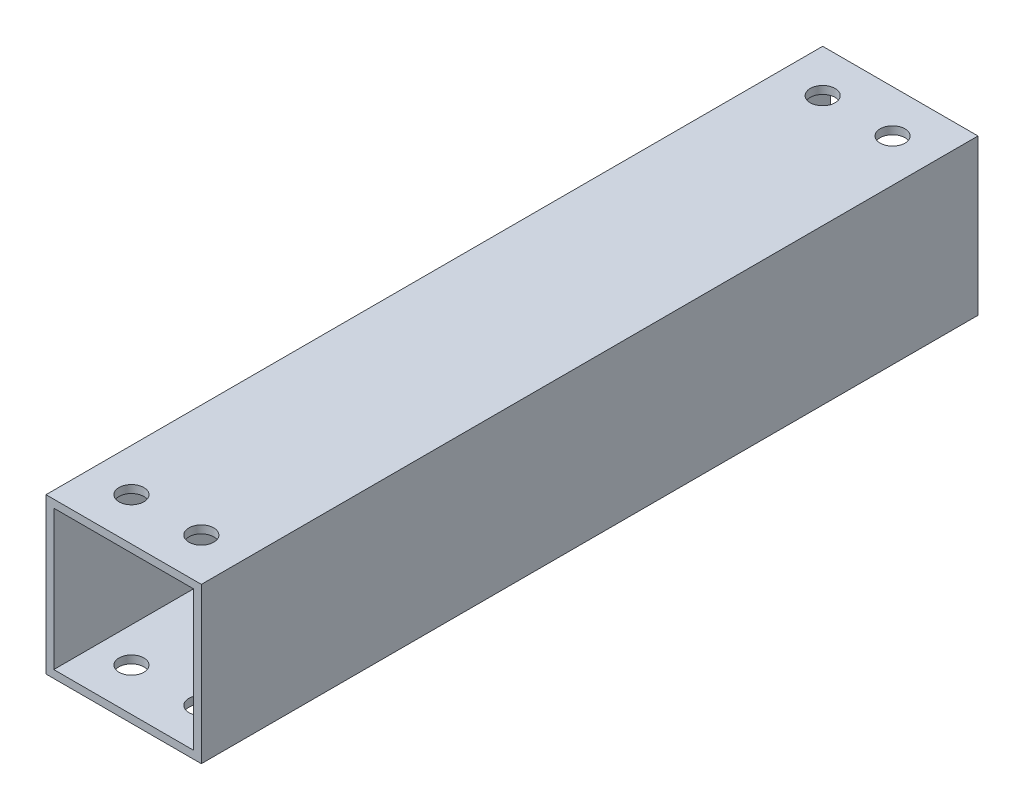
ISO-10303-21;
HEADER;
FILE_DESCRIPTION(('STEP AP214'),'2;1');
FILE_NAME('part.step','',(''),(''),'','','');
FILE_SCHEMA(('AUTOMOTIVE_DESIGN { 1 0 10303 214 1 1 1 1 }'));
ENDSEC;
DATA;
#1=APPLICATION_CONTEXT('core data for automotive mechanical design processes');
#2=APPLICATION_PROTOCOL_DEFINITION('international standard','automotive_design',2000,#1);
#3=PRODUCT_CONTEXT('',#1,'mechanical');
#4=PRODUCT('Part','Part','',(#3));
#5=PRODUCT_RELATED_PRODUCT_CATEGORY('part','',(#4));
#6=PRODUCT_DEFINITION_FORMATION('','',#4);
#7=PRODUCT_DEFINITION_CONTEXT('part definition',#1,'design');
#8=PRODUCT_DEFINITION('design','',#6,#7);
#9=PRODUCT_DEFINITION_SHAPE('','',#8);
#10=(LENGTH_UNIT() NAMED_UNIT(*) SI_UNIT(.MILLI.,.METRE.));
#11=(NAMED_UNIT(*) PLANE_ANGLE_UNIT() SI_UNIT($,.RADIAN.));
#12=(NAMED_UNIT(*) SI_UNIT($,.STERADIAN.) SOLID_ANGLE_UNIT());
#13=UNCERTAINTY_MEASURE_WITH_UNIT(LENGTH_MEASURE(1.E-05),#10,'distance_accuracy_value','');
#14=(GEOMETRIC_REPRESENTATION_CONTEXT(3) GLOBAL_UNCERTAINTY_ASSIGNED_CONTEXT((#13)) GLOBAL_UNIT_ASSIGNED_CONTEXT((#10,
#11,#12)) REPRESENTATION_CONTEXT('',''));
#15=CARTESIAN_POINT('',(0.,0.,0.));
#16=DIRECTION('',(0.,0.,1.));
#17=DIRECTION('',(1.,0.,0.));
#18=AXIS2_PLACEMENT_3D('',#15,#16,#17);
#19=CARTESIAN_POINT('',(0.,0.,100.));
#20=DIRECTION('',(0.,0.,1.));
#21=DIRECTION('',(1.,0.,0.));
#22=AXIS2_PLACEMENT_3D('',#19,#20,#21);
#23=PLANE('',#22);
#24=DIRECTION('',(0.,1.,0.));
#25=VECTOR('',#24,1.);
#26=CARTESIAN_POINT('',(10.,10.,100.));
#27=LINE('',#26,#25);
#28=CARTESIAN_POINT('',(10.,-10.,100.));
#29=VERTEX_POINT('',#28);
#30=CARTESIAN_POINT('',(10.,10.,100.));
#31=VERTEX_POINT('',#30);
#32=EDGE_CURVE('E143',#29,#31,#27,.T.);
#33=ORIENTED_EDGE('',*,*,#32,.T.);
#34=DIRECTION('',(-1.,0.,0.));
#35=VECTOR('',#34,1.);
#36=CARTESIAN_POINT('',(-10.,10.,100.));
#37=LINE('',#36,#35);
#38=CARTESIAN_POINT('',(-10.,10.,100.));
#39=VERTEX_POINT('',#38);
#40=EDGE_CURVE('E146',#31,#39,#37,.T.);
#41=ORIENTED_EDGE('',*,*,#40,.T.);
#42=DIRECTION('',(0.,-1.,0.));
#43=VECTOR('',#42,1.);
#44=CARTESIAN_POINT('',(-10.,10.,100.));
#45=LINE('',#44,#43);
#46=CARTESIAN_POINT('',(-10.,-10.,100.));
#47=VERTEX_POINT('',#46);
#48=EDGE_CURVE('E149',#39,#47,#45,.T.);
#49=ORIENTED_EDGE('',*,*,#48,.T.);
#50=DIRECTION('',(1.,0.,0.));
#51=VECTOR('',#50,1.);
#52=CARTESIAN_POINT('',(-10.,-10.,100.));
#53=LINE('',#52,#51);
#54=EDGE_CURVE('E151',#47,#29,#53,.T.);
#55=ORIENTED_EDGE('',*,*,#54,.T.);
#56=EDGE_LOOP('',(#33,#41,#49,#55));
#57=FACE_BOUND('',#56,.T.);
#58=DIRECTION('',(-1.,0.,0.));
#59=VECTOR('',#58,1.);
#60=CARTESIAN_POINT('',(-9.,9.,100.));
#61=LINE('',#60,#59);
#62=CARTESIAN_POINT('',(9.,9.,100.));
#63=VERTEX_POINT('',#62);
#64=CARTESIAN_POINT('',(-9.,9.,100.));
#65=VERTEX_POINT('',#64);
#66=EDGE_CURVE('E113',#63,#65,#61,.T.);
#67=ORIENTED_EDGE('',*,*,#66,.F.);
#68=DIRECTION('',(0.,1.,0.));
#69=VECTOR('',#68,1.);
#70=CARTESIAN_POINT('',(9.,9.,100.));
#71=LINE('',#70,#69);
#72=CARTESIAN_POINT('',(9.,-9.,100.));
#73=VERTEX_POINT('',#72);
#74=EDGE_CURVE('E105',#73,#63,#71,.T.);
#75=ORIENTED_EDGE('',*,*,#74,.F.);
#76=DIRECTION('',(1.,0.,0.));
#77=VECTOR('',#76,1.);
#78=CARTESIAN_POINT('',(-9.,-9.,100.));
#79=LINE('',#78,#77);
#80=CARTESIAN_POINT('',(-9.,-9.,100.));
#81=VERTEX_POINT('',#80);
#82=EDGE_CURVE('E127',#81,#73,#79,.T.);
#83=ORIENTED_EDGE('',*,*,#82,.F.);
#84=DIRECTION('',(0.,-1.,0.));
#85=VECTOR('',#84,1.);
#86=CARTESIAN_POINT('',(-9.,9.,100.));
#87=LINE('',#86,#85);
#88=EDGE_CURVE('E125',#65,#81,#87,.T.);
#89=ORIENTED_EDGE('',*,*,#88,.F.);
#90=EDGE_LOOP('',(#67,#75,#83,#89));
#91=FACE_BOUND('',#90,.T.);
#92=ADVANCED_FACE('F38',(#57,#91),#23,.T.);
#93=CARTESIAN_POINT('',(0.,0.,0.));
#94=DIRECTION('',(0.,0.,1.));
#95=DIRECTION('',(1.,0.,0.));
#96=AXIS2_PLACEMENT_3D('',#93,#94,#95);
#97=PLANE('',#96);
#98=DIRECTION('',(0.,1.,0.));
#99=VECTOR('',#98,1.);
#100=CARTESIAN_POINT('',(10.,10.,0.));
#101=LINE('',#100,#99);
#102=CARTESIAN_POINT('',(10.,-10.,0.));
#103=VERTEX_POINT('',#102);
#104=CARTESIAN_POINT('',(10.,10.,0.));
#105=VERTEX_POINT('',#104);
#106=EDGE_CURVE('E121',#103,#105,#101,.T.);
#107=ORIENTED_EDGE('',*,*,#106,.F.);
#108=DIRECTION('',(1.,0.,0.));
#109=VECTOR('',#108,1.);
#110=CARTESIAN_POINT('',(-10.,-10.,0.));
#111=LINE('',#110,#109);
#112=CARTESIAN_POINT('',(-10.,-10.,0.));
#113=VERTEX_POINT('',#112);
#114=EDGE_CURVE('E147',#113,#103,#111,.T.);
#115=ORIENTED_EDGE('',*,*,#114,.F.);
#116=DIRECTION('',(0.,-1.,0.));
#117=VECTOR('',#116,1.);
#118=CARTESIAN_POINT('',(-10.,10.,0.));
#119=LINE('',#118,#117);
#120=CARTESIAN_POINT('',(-10.,10.,0.));
#121=VERTEX_POINT('',#120);
#122=EDGE_CURVE('E158',#121,#113,#119,.T.);
#123=ORIENTED_EDGE('',*,*,#122,.F.);
#124=DIRECTION('',(-1.,0.,0.));
#125=VECTOR('',#124,1.);
#126=CARTESIAN_POINT('',(-10.,10.,0.));
#127=LINE('',#126,#125);
#128=EDGE_CURVE('E156',#105,#121,#127,.T.);
#129=ORIENTED_EDGE('',*,*,#128,.F.);
#130=EDGE_LOOP('',(#107,#115,#123,#129));
#131=FACE_BOUND('',#130,.T.);
#132=DIRECTION('',(0.,1.,0.));
#133=VECTOR('',#132,1.);
#134=CARTESIAN_POINT('',(9.,9.,0.));
#135=LINE('',#134,#133);
#136=CARTESIAN_POINT('',(9.,-9.,0.));
#137=VERTEX_POINT('',#136);
#138=CARTESIAN_POINT('',(9.,9.,0.));
#139=VERTEX_POINT('',#138);
#140=EDGE_CURVE('E63',#137,#139,#135,.T.);
#141=ORIENTED_EDGE('',*,*,#140,.T.);
#142=DIRECTION('',(-1.,0.,0.));
#143=VECTOR('',#142,1.);
#144=CARTESIAN_POINT('',(-9.,9.,0.));
#145=LINE('',#144,#143);
#146=CARTESIAN_POINT('',(-9.,9.,0.));
#147=VERTEX_POINT('',#146);
#148=EDGE_CURVE('E120',#139,#147,#145,.T.);
#149=ORIENTED_EDGE('',*,*,#148,.T.);
#150=DIRECTION('',(0.,-1.,0.));
#151=VECTOR('',#150,1.);
#152=CARTESIAN_POINT('',(-9.,9.,0.));
#153=LINE('',#152,#151);
#154=CARTESIAN_POINT('',(-9.,-9.,0.));
#155=VERTEX_POINT('',#154);
#156=EDGE_CURVE('E135',#147,#155,#153,.T.);
#157=ORIENTED_EDGE('',*,*,#156,.T.);
#158=DIRECTION('',(1.,0.,0.));
#159=VECTOR('',#158,1.);
#160=CARTESIAN_POINT('',(-9.,-9.,0.));
#161=LINE('',#160,#159);
#162=EDGE_CURVE('E114',#155,#137,#161,.T.);
#163=ORIENTED_EDGE('',*,*,#162,.T.);
#164=EDGE_LOOP('',(#141,#149,#157,#163));
#165=FACE_BOUND('',#164,.T.);
#166=ADVANCED_FACE('F210',(#131,#165),#97,.F.);
#167=CARTESIAN_POINT('',(10.,10.,100.));
#168=DIRECTION('',(-1.,0.,0.));
#169=DIRECTION('',(0.,0.,1.));
#170=AXIS2_PLACEMENT_3D('',#167,#168,#169);
#171=PLANE('',#170);
#172=ORIENTED_EDGE('',*,*,#106,.T.);
#173=DIRECTION('',(0.,0.,-1.));
#174=VECTOR('',#173,1.);
#175=CARTESIAN_POINT('',(10.,10.,100.));
#176=LINE('',#175,#174);
#177=EDGE_CURVE('E11',#31,#105,#176,.T.);
#178=ORIENTED_EDGE('',*,*,#177,.F.);
#179=ORIENTED_EDGE('',*,*,#32,.F.);
#180=DIRECTION('',(0.,0.,-1.));
#181=VECTOR('',#180,1.);
#182=CARTESIAN_POINT('',(10.,-10.,100.));
#183=LINE('',#182,#181);
#184=EDGE_CURVE('E153',#29,#103,#183,.T.);
#185=ORIENTED_EDGE('',*,*,#184,.T.);
#186=EDGE_LOOP('',(#172,#178,#179,#185));
#187=FACE_BOUND('',#186,.T.);
#188=ADVANCED_FACE('F40',(#187),#171,.F.);
#189=CARTESIAN_POINT('',(-10.,10.,100.));
#190=DIRECTION('',(0.,-1.,0.));
#191=DIRECTION('',(0.,0.,-1.));
#192=AXIS2_PLACEMENT_3D('',#189,#190,#191);
#193=PLANE('',#192);
#194=CARTESIAN_POINT('',(4.5,10.,5.50000000000001));
#195=DIRECTION('',(0.,1.,0.));
#196=DIRECTION('',(0.,0.,-1.));
#197=AXIS2_PLACEMENT_3D('',#194,#195,#196);
#198=CIRCLE('',#197,1.6);
#199=CARTESIAN_POINT('',(4.5,10.,3.90000000000001));
#200=VERTEX_POINT('',#199);
#201=EDGE_CURVE('E246',#200,#200,#198,.T.);
#202=ORIENTED_EDGE('',*,*,#201,.F.);
#203=EDGE_LOOP('',(#202));
#204=FACE_BOUND('',#203,.T.);
#205=CARTESIAN_POINT('',(-4.5,10.,5.50000000000001));
#206=DIRECTION('',(0.,1.,0.));
#207=DIRECTION('',(0.,0.,1.));
#208=AXIS2_PLACEMENT_3D('',#205,#206,#207);
#209=CIRCLE('',#208,1.6);
#210=CARTESIAN_POINT('',(-4.5,10.,7.1));
#211=VERTEX_POINT('',#210);
#212=EDGE_CURVE('E250',#211,#211,#209,.T.);
#213=ORIENTED_EDGE('',*,*,#212,.F.);
#214=EDGE_LOOP('',(#213));
#215=FACE_BOUND('',#214,.T.);
#216=CARTESIAN_POINT('',(-4.5,10.,94.5));
#217=DIRECTION('',(0.,1.,0.));
#218=DIRECTION('',(0.,0.,-1.));
#219=AXIS2_PLACEMENT_3D('',#216,#217,#218);
#220=CIRCLE('',#219,1.6);
#221=CARTESIAN_POINT('',(-4.5,10.,92.9));
#222=VERTEX_POINT('',#221);
#223=EDGE_CURVE('E254',#222,#222,#220,.T.);
#224=ORIENTED_EDGE('',*,*,#223,.F.);
#225=EDGE_LOOP('',(#224));
#226=FACE_BOUND('',#225,.T.);
#227=CARTESIAN_POINT('',(4.5,10.,94.5));
#228=DIRECTION('',(0.,1.,0.));
#229=DIRECTION('',(0.,0.,1.));
#230=AXIS2_PLACEMENT_3D('',#227,#228,#229);
#231=CIRCLE('',#230,1.6);
#232=CARTESIAN_POINT('',(4.5,10.,96.1));
#233=VERTEX_POINT('',#232);
#234=EDGE_CURVE('E258',#233,#233,#231,.T.);
#235=ORIENTED_EDGE('',*,*,#234,.F.);
#236=EDGE_LOOP('',(#235));
#237=FACE_BOUND('',#236,.T.);
#238=ORIENTED_EDGE('',*,*,#128,.T.);
#239=DIRECTION('',(0.,0.,-1.));
#240=VECTOR('',#239,1.);
#241=CARTESIAN_POINT('',(-10.,10.,100.));
#242=LINE('',#241,#240);
#243=EDGE_CURVE('E47',#39,#121,#242,.T.);
#244=ORIENTED_EDGE('',*,*,#243,.F.);
#245=ORIENTED_EDGE('',*,*,#40,.F.);
#246=ORIENTED_EDGE('',*,*,#177,.T.);
#247=EDGE_LOOP('',(#238,#244,#245,#246));
#248=FACE_BOUND('',#247,.T.);
#249=ADVANCED_FACE('F235',(#204,#215,#226,#237,#248),#193,.F.);
#250=CARTESIAN_POINT('',(-10.,10.,100.));
#251=DIRECTION('',(1.,0.,0.));
#252=DIRECTION('',(0.,0.,-1.));
#253=AXIS2_PLACEMENT_3D('',#250,#251,#252);
#254=PLANE('',#253);
#255=ORIENTED_EDGE('',*,*,#122,.T.);
#256=DIRECTION('',(0.,0.,-1.));
#257=VECTOR('',#256,1.);
#258=CARTESIAN_POINT('',(-10.,-10.,100.));
#259=LINE('',#258,#257);
#260=EDGE_CURVE('E163',#47,#113,#259,.T.);
#261=ORIENTED_EDGE('',*,*,#260,.F.);
#262=ORIENTED_EDGE('',*,*,#48,.F.);
#263=ORIENTED_EDGE('',*,*,#243,.T.);
#264=EDGE_LOOP('',(#255,#261,#262,#263));
#265=FACE_BOUND('',#264,.T.);
#266=ADVANCED_FACE('F232',(#265),#254,.F.);
#267=CARTESIAN_POINT('',(-10.,-10.,100.));
#268=DIRECTION('',(0.,1.,0.));
#269=DIRECTION('',(0.,0.,1.));
#270=AXIS2_PLACEMENT_3D('',#267,#268,#269);
#271=PLANE('',#270);
#272=CARTESIAN_POINT('',(4.5,-10.,5.50000000000001));
#273=DIRECTION('',(0.,1.,0.));
#274=DIRECTION('',(0.,0.,-1.));
#275=AXIS2_PLACEMENT_3D('',#272,#273,#274);
#276=CIRCLE('',#275,1.6);
#277=CARTESIAN_POINT('',(4.5,-10.,3.90000000000001));
#278=VERTEX_POINT('',#277);
#279=EDGE_CURVE('E278',#278,#278,#276,.T.);
#280=ORIENTED_EDGE('',*,*,#279,.T.);
#281=EDGE_LOOP('',(#280));
#282=FACE_BOUND('',#281,.T.);
#283=CARTESIAN_POINT('',(-4.5,-10.,5.50000000000001));
#284=DIRECTION('',(0.,1.,0.));
#285=DIRECTION('',(0.,0.,1.));
#286=AXIS2_PLACEMENT_3D('',#283,#284,#285);
#287=CIRCLE('',#286,1.6);
#288=CARTESIAN_POINT('',(-4.5,-10.,7.1));
#289=VERTEX_POINT('',#288);
#290=EDGE_CURVE('E282',#289,#289,#287,.T.);
#291=ORIENTED_EDGE('',*,*,#290,.T.);
#292=EDGE_LOOP('',(#291));
#293=FACE_BOUND('',#292,.T.);
#294=CARTESIAN_POINT('',(-4.5,-10.,94.5));
#295=DIRECTION('',(0.,1.,0.));
#296=DIRECTION('',(0.,0.,-1.));
#297=AXIS2_PLACEMENT_3D('',#294,#295,#296);
#298=CIRCLE('',#297,1.6);
#299=CARTESIAN_POINT('',(-4.5,-10.,92.9));
#300=VERTEX_POINT('',#299);
#301=EDGE_CURVE('E271',#300,#300,#298,.T.);
#302=ORIENTED_EDGE('',*,*,#301,.T.);
#303=EDGE_LOOP('',(#302));
#304=FACE_BOUND('',#303,.T.);
#305=CARTESIAN_POINT('',(4.5,-10.,94.5));
#306=DIRECTION('',(0.,1.,0.));
#307=DIRECTION('',(0.,0.,1.));
#308=AXIS2_PLACEMENT_3D('',#305,#306,#307);
#309=CIRCLE('',#308,1.6);
#310=CARTESIAN_POINT('',(4.5,-10.,96.1));
#311=VERTEX_POINT('',#310);
#312=EDGE_CURVE('E172',#311,#311,#309,.T.);
#313=ORIENTED_EDGE('',*,*,#312,.T.);
#314=EDGE_LOOP('',(#313));
#315=FACE_BOUND('',#314,.T.);
#316=ORIENTED_EDGE('',*,*,#114,.T.);
#317=ORIENTED_EDGE('',*,*,#184,.F.);
#318=ORIENTED_EDGE('',*,*,#54,.F.);
#319=ORIENTED_EDGE('',*,*,#260,.T.);
#320=EDGE_LOOP('',(#316,#317,#318,#319));
#321=FACE_BOUND('',#320,.T.);
#322=ADVANCED_FACE('F229',(#282,#293,#304,#315,#321),#271,.F.);
#323=CARTESIAN_POINT('',(9.,9.,100.));
#324=DIRECTION('',(-1.,0.,0.));
#325=DIRECTION('',(0.,0.,1.));
#326=AXIS2_PLACEMENT_3D('',#323,#324,#325);
#327=PLANE('',#326);
#328=ORIENTED_EDGE('',*,*,#140,.F.);
#329=DIRECTION('',(0.,0.,-1.));
#330=VECTOR('',#329,1.);
#331=CARTESIAN_POINT('',(9.,-9.,100.));
#332=LINE('',#331,#330);
#333=EDGE_CURVE('E109',#73,#137,#332,.T.);
#334=ORIENTED_EDGE('',*,*,#333,.F.);
#335=ORIENTED_EDGE('',*,*,#74,.T.);
#336=DIRECTION('',(0.,0.,-1.));
#337=VECTOR('',#336,1.);
#338=CARTESIAN_POINT('',(9.,9.,100.));
#339=LINE('',#338,#337);
#340=EDGE_CURVE('E108',#63,#139,#339,.T.);
#341=ORIENTED_EDGE('',*,*,#340,.T.);
#342=EDGE_LOOP('',(#328,#334,#335,#341));
#343=FACE_BOUND('',#342,.T.);
#344=ADVANCED_FACE('F107',(#343),#327,.T.);
#345=CARTESIAN_POINT('',(-9.,9.,100.));
#346=DIRECTION('',(0.,-1.,0.));
#347=DIRECTION('',(0.,0.,-1.));
#348=AXIS2_PLACEMENT_3D('',#345,#346,#347);
#349=PLANE('',#348);
#350=CARTESIAN_POINT('',(4.5,9.,5.50000000000001));
#351=DIRECTION('',(0.,-1.,0.));
#352=DIRECTION('',(0.,0.,-1.));
#353=AXIS2_PLACEMENT_3D('',#350,#351,#352);
#354=CIRCLE('',#353,1.6);
#355=CARTESIAN_POINT('',(4.5,9.,3.90000000000001));
#356=VERTEX_POINT('',#355);
#357=EDGE_CURVE('E133',#356,#356,#354,.T.);
#358=ORIENTED_EDGE('',*,*,#357,.F.);
#359=EDGE_LOOP('',(#358));
#360=FACE_BOUND('',#359,.T.);
#361=CARTESIAN_POINT('',(-4.5,9.,5.50000000000001));
#362=DIRECTION('',(0.,-1.,0.));
#363=DIRECTION('',(0.,0.,-1.));
#364=AXIS2_PLACEMENT_3D('',#361,#362,#363);
#365=CIRCLE('',#364,1.6);
#366=CARTESIAN_POINT('',(-4.5,9.,3.90000000000001));
#367=VERTEX_POINT('',#366);
#368=EDGE_CURVE('E178',#367,#367,#365,.T.);
#369=ORIENTED_EDGE('',*,*,#368,.F.);
#370=EDGE_LOOP('',(#369));
#371=FACE_BOUND('',#370,.T.);
#372=CARTESIAN_POINT('',(-4.5,9.,94.5));
#373=DIRECTION('',(0.,-1.,0.));
#374=DIRECTION('',(0.,0.,-1.));
#375=AXIS2_PLACEMENT_3D('',#372,#373,#374);
#376=CIRCLE('',#375,1.6);
#377=CARTESIAN_POINT('',(-4.5,9.,92.9));
#378=VERTEX_POINT('',#377);
#379=EDGE_CURVE('E175',#378,#378,#376,.T.);
#380=ORIENTED_EDGE('',*,*,#379,.F.);
#381=EDGE_LOOP('',(#380));
#382=FACE_BOUND('',#381,.T.);
#383=CARTESIAN_POINT('',(4.5,9.,94.5));
#384=DIRECTION('',(0.,-1.,0.));
#385=DIRECTION('',(0.,0.,-1.));
#386=AXIS2_PLACEMENT_3D('',#383,#384,#385);
#387=CIRCLE('',#386,1.6);
#388=CARTESIAN_POINT('',(4.5,9.,92.9));
#389=VERTEX_POINT('',#388);
#390=EDGE_CURVE('E171',#389,#389,#387,.T.);
#391=ORIENTED_EDGE('',*,*,#390,.F.);
#392=EDGE_LOOP('',(#391));
#393=FACE_BOUND('',#392,.T.);
#394=ORIENTED_EDGE('',*,*,#148,.F.);
#395=ORIENTED_EDGE('',*,*,#340,.F.);
#396=ORIENTED_EDGE('',*,*,#66,.T.);
#397=DIRECTION('',(0.,0.,-1.));
#398=VECTOR('',#397,1.);
#399=CARTESIAN_POINT('',(-9.,9.,100.));
#400=LINE('',#399,#398);
#401=EDGE_CURVE('E122',#65,#147,#400,.T.);
#402=ORIENTED_EDGE('',*,*,#401,.T.);
#403=EDGE_LOOP('',(#394,#395,#396,#402));
#404=FACE_BOUND('',#403,.T.);
#405=ADVANCED_FACE('F117',(#360,#371,#382,#393,#404),#349,.T.);
#406=CARTESIAN_POINT('',(-9.,9.,100.));
#407=DIRECTION('',(1.,0.,0.));
#408=DIRECTION('',(0.,0.,-1.));
#409=AXIS2_PLACEMENT_3D('',#406,#407,#408);
#410=PLANE('',#409);
#411=ORIENTED_EDGE('',*,*,#156,.F.);
#412=ORIENTED_EDGE('',*,*,#401,.F.);
#413=ORIENTED_EDGE('',*,*,#88,.T.);
#414=DIRECTION('',(0.,0.,-1.));
#415=VECTOR('',#414,1.);
#416=CARTESIAN_POINT('',(-9.,-9.,100.));
#417=LINE('',#416,#415);
#418=EDGE_CURVE('E55',#81,#155,#417,.T.);
#419=ORIENTED_EDGE('',*,*,#418,.T.);
#420=EDGE_LOOP('',(#411,#412,#413,#419));
#421=FACE_BOUND('',#420,.T.);
#422=ADVANCED_FACE('F202',(#421),#410,.T.);
#423=CARTESIAN_POINT('',(-9.,-9.,100.));
#424=DIRECTION('',(0.,1.,0.));
#425=DIRECTION('',(0.,0.,1.));
#426=AXIS2_PLACEMENT_3D('',#423,#424,#425);
#427=PLANE('',#426);
#428=CARTESIAN_POINT('',(4.5,-9.,5.50000000000001));
#429=DIRECTION('',(0.,1.,0.));
#430=DIRECTION('',(0.,0.,1.));
#431=AXIS2_PLACEMENT_3D('',#428,#429,#430);
#432=CIRCLE('',#431,1.6);
#433=CARTESIAN_POINT('',(4.5,-9.,7.1));
#434=VERTEX_POINT('',#433);
#435=EDGE_CURVE('E42',#434,#434,#432,.T.);
#436=ORIENTED_EDGE('',*,*,#435,.F.);
#437=EDGE_LOOP('',(#436));
#438=FACE_BOUND('',#437,.T.);
#439=CARTESIAN_POINT('',(-4.5,-9.,5.50000000000001));
#440=DIRECTION('',(0.,1.,0.));
#441=DIRECTION('',(0.,0.,1.));
#442=AXIS2_PLACEMENT_3D('',#439,#440,#441);
#443=CIRCLE('',#442,1.6);
#444=CARTESIAN_POINT('',(-4.5,-9.,7.1));
#445=VERTEX_POINT('',#444);
#446=EDGE_CURVE('E176',#445,#445,#443,.T.);
#447=ORIENTED_EDGE('',*,*,#446,.F.);
#448=EDGE_LOOP('',(#447));
#449=FACE_BOUND('',#448,.T.);
#450=CARTESIAN_POINT('',(-4.5,-9.,94.5));
#451=DIRECTION('',(0.,1.,0.));
#452=DIRECTION('',(0.,0.,1.));
#453=AXIS2_PLACEMENT_3D('',#450,#451,#452);
#454=CIRCLE('',#453,1.6);
#455=CARTESIAN_POINT('',(-4.5,-9.,96.1));
#456=VERTEX_POINT('',#455);
#457=EDGE_CURVE('E173',#456,#456,#454,.T.);
#458=ORIENTED_EDGE('',*,*,#457,.F.);
#459=EDGE_LOOP('',(#458));
#460=FACE_BOUND('',#459,.T.);
#461=CARTESIAN_POINT('',(4.5,-9.,94.5));
#462=DIRECTION('',(0.,1.,0.));
#463=DIRECTION('',(0.,0.,1.));
#464=AXIS2_PLACEMENT_3D('',#461,#462,#463);
#465=CIRCLE('',#464,1.6);
#466=CARTESIAN_POINT('',(4.5,-9.,96.1));
#467=VERTEX_POINT('',#466);
#468=EDGE_CURVE('E168',#467,#467,#465,.T.);
#469=ORIENTED_EDGE('',*,*,#468,.F.);
#470=EDGE_LOOP('',(#469));
#471=FACE_BOUND('',#470,.T.);
#472=ORIENTED_EDGE('',*,*,#162,.F.);
#473=ORIENTED_EDGE('',*,*,#418,.F.);
#474=ORIENTED_EDGE('',*,*,#82,.T.);
#475=ORIENTED_EDGE('',*,*,#333,.T.);
#476=EDGE_LOOP('',(#472,#473,#474,#475));
#477=FACE_BOUND('',#476,.T.);
#478=ADVANCED_FACE('F198',(#438,#449,#460,#471,#477),#427,.T.);
#479=CARTESIAN_POINT('',(4.5,-10.,94.5));
#480=DIRECTION('',(0.,1.,0.));
#481=DIRECTION('',(0.,0.,1.));
#482=AXIS2_PLACEMENT_3D('',#479,#480,#481);
#483=CYLINDRICAL_SURFACE('',#482,1.6);
#484=ORIENTED_EDGE('',*,*,#468,.T.);
#485=EDGE_LOOP('',(#484));
#486=FACE_BOUND('',#485,.T.);
#487=ORIENTED_EDGE('',*,*,#312,.F.);
#488=EDGE_LOOP('',(#487));
#489=FACE_BOUND('',#488,.T.);
#490=ADVANCED_FACE('F201',(#486,#489),#483,.F.);
#491=CARTESIAN_POINT('',(-4.5,-10.,94.5));
#492=DIRECTION('',(0.,1.,0.));
#493=DIRECTION('',(0.,0.,1.));
#494=AXIS2_PLACEMENT_3D('',#491,#492,#493);
#495=CYLINDRICAL_SURFACE('',#494,1.6);
#496=ORIENTED_EDGE('',*,*,#457,.T.);
#497=EDGE_LOOP('',(#496));
#498=FACE_BOUND('',#497,.T.);
#499=ORIENTED_EDGE('',*,*,#301,.F.);
#500=EDGE_LOOP('',(#499));
#501=FACE_BOUND('',#500,.T.);
#502=ADVANCED_FACE('F291',(#498,#501),#495,.F.);
#503=CARTESIAN_POINT('',(-4.5,-10.,5.50000000000001));
#504=DIRECTION('',(0.,1.,0.));
#505=DIRECTION('',(0.,0.,1.));
#506=AXIS2_PLACEMENT_3D('',#503,#504,#505);
#507=CYLINDRICAL_SURFACE('',#506,1.6);
#508=ORIENTED_EDGE('',*,*,#446,.T.);
#509=EDGE_LOOP('',(#508));
#510=FACE_BOUND('',#509,.T.);
#511=ORIENTED_EDGE('',*,*,#290,.F.);
#512=EDGE_LOOP('',(#511));
#513=FACE_BOUND('',#512,.T.);
#514=ADVANCED_FACE('F299',(#510,#513),#507,.F.);
#515=CARTESIAN_POINT('',(4.5,-10.,5.50000000000001));
#516=DIRECTION('',(0.,1.,0.));
#517=DIRECTION('',(0.,0.,1.));
#518=AXIS2_PLACEMENT_3D('',#515,#516,#517);
#519=CYLINDRICAL_SURFACE('',#518,1.6);
#520=ORIENTED_EDGE('',*,*,#435,.T.);
#521=EDGE_LOOP('',(#520));
#522=FACE_BOUND('',#521,.T.);
#523=ORIENTED_EDGE('',*,*,#279,.F.);
#524=EDGE_LOOP('',(#523));
#525=FACE_BOUND('',#524,.T.);
#526=ADVANCED_FACE('F195',(#522,#525),#519,.F.);
#527=ORIENTED_EDGE('',*,*,#390,.T.);
#528=EDGE_LOOP('',(#527));
#529=FACE_BOUND('',#528,.T.);
#530=ORIENTED_EDGE('',*,*,#234,.T.);
#531=EDGE_LOOP('',(#530));
#532=FACE_BOUND('',#531,.T.);
#533=ADVANCED_FACE('F289',(#529,#532),#483,.F.);
#534=ORIENTED_EDGE('',*,*,#379,.T.);
#535=EDGE_LOOP('',(#534));
#536=FACE_BOUND('',#535,.T.);
#537=ORIENTED_EDGE('',*,*,#223,.T.);
#538=EDGE_LOOP('',(#537));
#539=FACE_BOUND('',#538,.T.);
#540=ADVANCED_FACE('F286',(#536,#539),#495,.F.);
#541=ORIENTED_EDGE('',*,*,#368,.T.);
#542=EDGE_LOOP('',(#541));
#543=FACE_BOUND('',#542,.T.);
#544=ORIENTED_EDGE('',*,*,#212,.T.);
#545=EDGE_LOOP('',(#544));
#546=FACE_BOUND('',#545,.T.);
#547=ADVANCED_FACE('F288',(#543,#546),#507,.F.);
#548=ORIENTED_EDGE('',*,*,#357,.T.);
#549=EDGE_LOOP('',(#548));
#550=FACE_BOUND('',#549,.T.);
#551=ORIENTED_EDGE('',*,*,#201,.T.);
#552=EDGE_LOOP('',(#551));
#553=FACE_BOUND('',#552,.T.);
#554=ADVANCED_FACE('F296',(#550,#553),#519,.F.);
#555=CLOSED_SHELL('',(#92,#166,#188,#249,#266,#322,#344,#405,#422,#478,#490,#502,#514,#526,#533,
#540,#547,#554));
#556=MANIFOLD_SOLID_BREP('B2',#555);
#557=ADVANCED_BREP_SHAPE_REPRESENTATION('',(#18,#556),#14);
#558=SHAPE_DEFINITION_REPRESENTATION(#9,#557);
ENDSEC;
END-ISO-10303-21;
